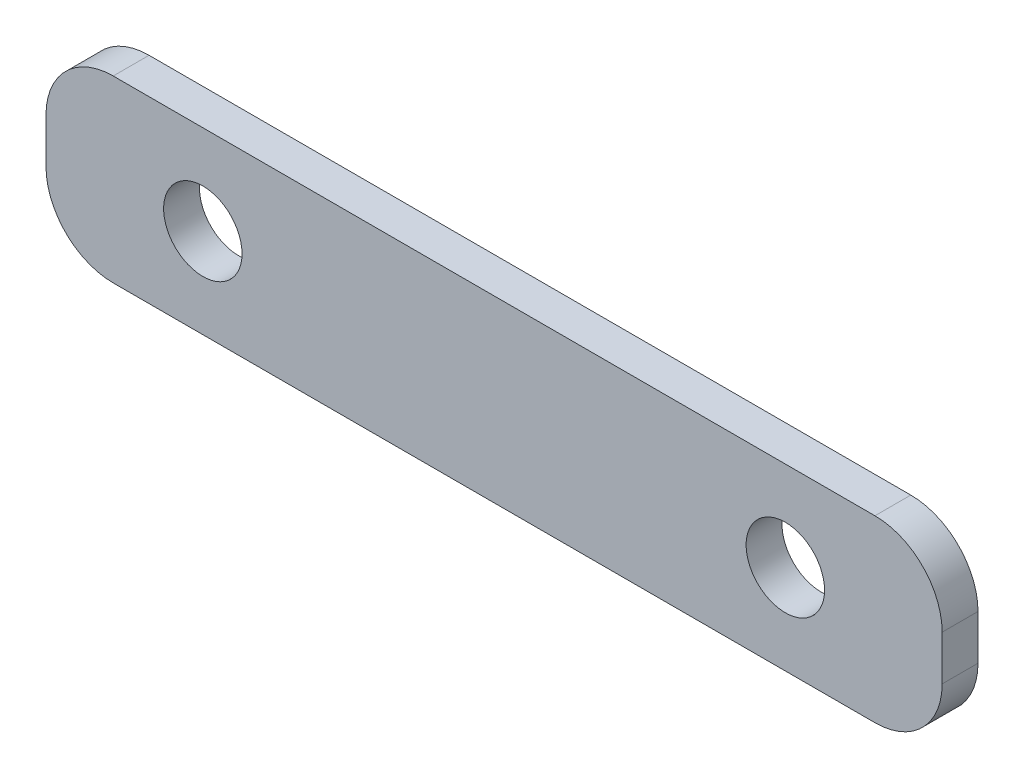
ISO-10303-21;
HEADER;
FILE_DESCRIPTION(('STEP AP214'),'2;1');
FILE_NAME('part.step','',(''),(''),'','','');
FILE_SCHEMA(('AUTOMOTIVE_DESIGN { 1 0 10303 214 1 1 1 1 }'));
ENDSEC;
DATA;
#1=APPLICATION_CONTEXT('core data for automotive mechanical design processes');
#2=APPLICATION_PROTOCOL_DEFINITION('international standard','automotive_design',2000,#1);
#3=PRODUCT_CONTEXT('',#1,'mechanical');
#4=PRODUCT('Part','Part','',(#3));
#5=PRODUCT_RELATED_PRODUCT_CATEGORY('part','',(#4));
#6=PRODUCT_DEFINITION_FORMATION('','',#4);
#7=PRODUCT_DEFINITION_CONTEXT('part definition',#1,'design');
#8=PRODUCT_DEFINITION('design','',#6,#7);
#9=PRODUCT_DEFINITION_SHAPE('','',#8);
#10=(LENGTH_UNIT() NAMED_UNIT(*) SI_UNIT(.MILLI.,.METRE.));
#11=(NAMED_UNIT(*) PLANE_ANGLE_UNIT() SI_UNIT($,.RADIAN.));
#12=(NAMED_UNIT(*) SI_UNIT($,.STERADIAN.) SOLID_ANGLE_UNIT());
#13=UNCERTAINTY_MEASURE_WITH_UNIT(LENGTH_MEASURE(1.E-05),#10,'distance_accuracy_value','');
#14=(GEOMETRIC_REPRESENTATION_CONTEXT(3) GLOBAL_UNCERTAINTY_ASSIGNED_CONTEXT((#13)) GLOBAL_UNIT_ASSIGNED_CONTEXT((#10,
#11,#12)) REPRESENTATION_CONTEXT('',''));
#15=CARTESIAN_POINT('',(0.,0.,0.));
#16=DIRECTION('',(0.,0.,1.));
#17=DIRECTION('',(1.,0.,0.));
#18=AXIS2_PLACEMENT_3D('',#15,#16,#17);
#19=CARTESIAN_POINT('',(200.,0.,4.));
#20=DIRECTION('',(0.,1.,0.));
#21=DIRECTION('',(-1.,0.,0.));
#22=AXIS2_PLACEMENT_3D('',#19,#20,#21);
#23=PLANE('',#22);
#24=DIRECTION('',(1.,0.,0.));
#25=VECTOR('',#24,1.);
#26=CARTESIAN_POINT('',(200.,0.,-4.));
#27=LINE('',#26,#25);
#28=CARTESIAN_POINT('',(15.,0.,-4.));
#29=VERTEX_POINT('',#28);
#30=CARTESIAN_POINT('',(185.,0.,-4.));
#31=VERTEX_POINT('',#30);
#32=EDGE_CURVE('E135',#29,#31,#27,.T.);
#33=ORIENTED_EDGE('',*,*,#32,.T.);
#34=DIRECTION('',(0.,0.,-1.));
#35=VECTOR('',#34,1.);
#36=CARTESIAN_POINT('',(185.,0.,4.));
#37=LINE('',#36,#35);
#38=CARTESIAN_POINT('',(185.,0.,4.));
#39=VERTEX_POINT('',#38);
#40=EDGE_CURVE('E110',#31,#39,#37,.F.);
#41=ORIENTED_EDGE('',*,*,#40,.T.);
#42=DIRECTION('',(1.,0.,0.));
#43=VECTOR('',#42,1.);
#44=CARTESIAN_POINT('',(200.,0.,4.));
#45=LINE('',#44,#43);
#46=CARTESIAN_POINT('',(15.,0.,4.));
#47=VERTEX_POINT('',#46);
#48=EDGE_CURVE('E148',#47,#39,#45,.T.);
#49=ORIENTED_EDGE('',*,*,#48,.F.);
#50=DIRECTION('',(0.,0.,-1.));
#51=VECTOR('',#50,1.);
#52=CARTESIAN_POINT('',(15.,0.,4.));
#53=LINE('',#52,#51);
#54=EDGE_CURVE('E116',#47,#29,#53,.T.);
#55=ORIENTED_EDGE('',*,*,#54,.T.);
#56=EDGE_LOOP('',(#33,#41,#49,#55));
#57=FACE_BOUND('',#56,.T.);
#58=ADVANCED_FACE('F39',(#57),#23,.F.);
#59=CARTESIAN_POINT('',(200.,40.,4.));
#60=DIRECTION('',(-1.,0.,0.));
#61=DIRECTION('',(0.,0.,1.));
#62=AXIS2_PLACEMENT_3D('',#59,#60,#61);
#63=PLANE('',#62);
#64=DIRECTION('',(0.,1.,0.));
#65=VECTOR('',#64,1.);
#66=CARTESIAN_POINT('',(200.,40.,4.));
#67=LINE('',#66,#65);
#68=CARTESIAN_POINT('',(200.,15.,4.));
#69=VERTEX_POINT('',#68);
#70=CARTESIAN_POINT('',(200.,25.,4.));
#71=VERTEX_POINT('',#70);
#72=EDGE_CURVE('E126',#69,#71,#67,.T.);
#73=ORIENTED_EDGE('',*,*,#72,.F.);
#74=DIRECTION('',(0.,0.,-1.));
#75=VECTOR('',#74,1.);
#76=CARTESIAN_POINT('',(200.,15.,4.));
#77=LINE('',#76,#75);
#78=CARTESIAN_POINT('',(200.,15.,-4.));
#79=VERTEX_POINT('',#78);
#80=EDGE_CURVE('E109',#69,#79,#77,.T.);
#81=ORIENTED_EDGE('',*,*,#80,.T.);
#82=DIRECTION('',(0.,1.,0.));
#83=VECTOR('',#82,1.);
#84=CARTESIAN_POINT('',(200.,40.,-4.));
#85=LINE('',#84,#83);
#86=CARTESIAN_POINT('',(200.,25.,-4.));
#87=VERTEX_POINT('',#86);
#88=EDGE_CURVE('E123',#79,#87,#85,.T.);
#89=ORIENTED_EDGE('',*,*,#88,.T.);
#90=DIRECTION('',(0.,0.,-1.));
#91=VECTOR('',#90,1.);
#92=CARTESIAN_POINT('',(200.,25.,4.));
#93=LINE('',#92,#91);
#94=EDGE_CURVE('E129',#87,#71,#93,.F.);
#95=ORIENTED_EDGE('',*,*,#94,.T.);
#96=EDGE_LOOP('',(#73,#81,#89,#95));
#97=FACE_BOUND('',#96,.T.);
#98=ADVANCED_FACE('F122',(#97),#63,.F.);
#99=CARTESIAN_POINT('',(0.,40.,4.));
#100=DIRECTION('',(0.,-1.,0.));
#101=DIRECTION('',(0.,0.,-1.));
#102=AXIS2_PLACEMENT_3D('',#99,#100,#101);
#103=PLANE('',#102);
#104=DIRECTION('',(-1.,0.,0.));
#105=VECTOR('',#104,1.);
#106=CARTESIAN_POINT('',(0.,40.,4.));
#107=LINE('',#106,#105);
#108=CARTESIAN_POINT('',(185.,40.,4.));
#109=VERTEX_POINT('',#108);
#110=CARTESIAN_POINT('',(15.,40.,4.));
#111=VERTEX_POINT('',#110);
#112=EDGE_CURVE('E197',#109,#111,#107,.T.);
#113=ORIENTED_EDGE('',*,*,#112,.F.);
#114=DIRECTION('',(0.,0.,-1.));
#115=VECTOR('',#114,1.);
#116=CARTESIAN_POINT('',(185.,40.,4.));
#117=LINE('',#116,#115);
#118=CARTESIAN_POINT('',(185.,40.,-4.));
#119=VERTEX_POINT('',#118);
#120=EDGE_CURVE('E178',#109,#119,#117,.T.);
#121=ORIENTED_EDGE('',*,*,#120,.T.);
#122=DIRECTION('',(-1.,0.,0.));
#123=VECTOR('',#122,1.);
#124=CARTESIAN_POINT('',(0.,40.,-4.));
#125=LINE('',#124,#123);
#126=CARTESIAN_POINT('',(15.,40.,-4.));
#127=VERTEX_POINT('',#126);
#128=EDGE_CURVE('E134',#119,#127,#125,.T.);
#129=ORIENTED_EDGE('',*,*,#128,.T.);
#130=DIRECTION('',(0.,0.,-1.));
#131=VECTOR('',#130,1.);
#132=CARTESIAN_POINT('',(15.,40.,4.));
#133=LINE('',#132,#131);
#134=EDGE_CURVE('E175',#127,#111,#133,.F.);
#135=ORIENTED_EDGE('',*,*,#134,.T.);
#136=EDGE_LOOP('',(#113,#121,#129,#135));
#137=FACE_BOUND('',#136,.T.);
#138=ADVANCED_FACE('F214',(#137),#103,.F.);
#139=CARTESIAN_POINT('',(0.,0.,4.));
#140=DIRECTION('',(1.,0.,0.));
#141=DIRECTION('',(0.,0.,-1.));
#142=AXIS2_PLACEMENT_3D('',#139,#140,#141);
#143=PLANE('',#142);
#144=DIRECTION('',(0.,-1.,0.));
#145=VECTOR('',#144,1.);
#146=CARTESIAN_POINT('',(0.,0.,-4.));
#147=LINE('',#146,#145);
#148=CARTESIAN_POINT('',(0.,25.,-4.));
#149=VERTEX_POINT('',#148);
#150=CARTESIAN_POINT('',(0.,15.,-4.));
#151=VERTEX_POINT('',#150);
#152=EDGE_CURVE('E140',#149,#151,#147,.T.);
#153=ORIENTED_EDGE('',*,*,#152,.T.);
#154=DIRECTION('',(0.,0.,-1.));
#155=VECTOR('',#154,1.);
#156=CARTESIAN_POINT('',(0.,15.,4.));
#157=LINE('',#156,#155);
#158=CARTESIAN_POINT('',(0.,15.,4.));
#159=VERTEX_POINT('',#158);
#160=EDGE_CURVE('E11',#151,#159,#157,.F.);
#161=ORIENTED_EDGE('',*,*,#160,.T.);
#162=DIRECTION('',(0.,-1.,0.));
#163=VECTOR('',#162,1.);
#164=CARTESIAN_POINT('',(0.,0.,4.));
#165=LINE('',#164,#163);
#166=CARTESIAN_POINT('',(0.,25.,4.));
#167=VERTEX_POINT('',#166);
#168=EDGE_CURVE('E150',#167,#159,#165,.T.);
#169=ORIENTED_EDGE('',*,*,#168,.F.);
#170=DIRECTION('',(0.,0.,-1.));
#171=VECTOR('',#170,1.);
#172=CARTESIAN_POINT('',(0.,25.,4.));
#173=LINE('',#172,#171);
#174=EDGE_CURVE('E48',#167,#149,#173,.T.);
#175=ORIENTED_EDGE('',*,*,#174,.T.);
#176=EDGE_LOOP('',(#153,#161,#169,#175));
#177=FACE_BOUND('',#176,.T.);
#178=ADVANCED_FACE('F185',(#177),#143,.F.);
#179=CARTESIAN_POINT('',(0.,0.,4.));
#180=DIRECTION('',(0.,0.,-1.));
#181=DIRECTION('',(-1.,0.,0.));
#182=AXIS2_PLACEMENT_3D('',#179,#180,#181);
#183=PLANE('',#182);
#184=CARTESIAN_POINT('',(35.,20.,4.));
#185=DIRECTION('',(0.,0.,1.));
#186=DIRECTION('',(1.,0.,0.));
#187=AXIS2_PLACEMENT_3D('',#184,#185,#186);
#188=CIRCLE('',#187,8.75);
#189=CARTESIAN_POINT('',(43.75,20.,4.));
#190=VERTEX_POINT('',#189);
#191=EDGE_CURVE('E310',#190,#190,#188,.T.);
#192=ORIENTED_EDGE('',*,*,#191,.F.);
#193=EDGE_LOOP('',(#192));
#194=FACE_BOUND('',#193,.T.);
#195=CARTESIAN_POINT('',(165.,20.,4.));
#196=DIRECTION('',(0.,0.,1.));
#197=DIRECTION('',(1.,0.,0.));
#198=AXIS2_PLACEMENT_3D('',#195,#196,#197);
#199=CIRCLE('',#198,8.75000000000001);
#200=CARTESIAN_POINT('',(173.75,20.,4.));
#201=VERTEX_POINT('',#200);
#202=EDGE_CURVE('E314',#201,#201,#199,.T.);
#203=ORIENTED_EDGE('',*,*,#202,.F.);
#204=EDGE_LOOP('',(#203));
#205=FACE_BOUND('',#204,.T.);
#206=ORIENTED_EDGE('',*,*,#48,.T.);
#207=CARTESIAN_POINT('',(185.,15.,4.));
#208=DIRECTION('',(0.,0.,-1.));
#209=DIRECTION('',(-1.,0.,0.));
#210=AXIS2_PLACEMENT_3D('',#207,#208,#209);
#211=CIRCLE('',#210,15.);
#212=EDGE_CURVE('E172',#39,#69,#211,.F.);
#213=ORIENTED_EDGE('',*,*,#212,.T.);
#214=ORIENTED_EDGE('',*,*,#72,.T.);
#215=CARTESIAN_POINT('',(185.,25.,4.));
#216=DIRECTION('',(0.,0.,-1.));
#217=DIRECTION('',(-1.,0.,0.));
#218=AXIS2_PLACEMENT_3D('',#215,#216,#217);
#219=CIRCLE('',#218,15.);
#220=EDGE_CURVE('E169',#71,#109,#219,.F.);
#221=ORIENTED_EDGE('',*,*,#220,.T.);
#222=ORIENTED_EDGE('',*,*,#112,.T.);
#223=CARTESIAN_POINT('',(15.,25.,4.));
#224=DIRECTION('',(0.,0.,-1.));
#225=DIRECTION('',(-1.,0.,0.));
#226=AXIS2_PLACEMENT_3D('',#223,#224,#225);
#227=CIRCLE('',#226,15.);
#228=EDGE_CURVE('E60',#111,#167,#227,.F.);
#229=ORIENTED_EDGE('',*,*,#228,.T.);
#230=ORIENTED_EDGE('',*,*,#168,.T.);
#231=CARTESIAN_POINT('',(15.,15.,4.));
#232=DIRECTION('',(0.,0.,-1.));
#233=DIRECTION('',(-1.,0.,0.));
#234=AXIS2_PLACEMENT_3D('',#231,#232,#233);
#235=CIRCLE('',#234,15.);
#236=EDGE_CURVE('E166',#159,#47,#235,.F.);
#237=ORIENTED_EDGE('',*,*,#236,.T.);
#238=EDGE_LOOP('',(#206,#213,#214,#221,#222,#229,#230,#237));
#239=FACE_BOUND('',#238,.T.);
#240=ADVANCED_FACE('F204',(#194,#205,#239),#183,.F.);
#241=CARTESIAN_POINT('',(0.,0.,-4.));
#242=DIRECTION('',(0.,0.,-1.));
#243=DIRECTION('',(-1.,0.,0.));
#244=AXIS2_PLACEMENT_3D('',#241,#242,#243);
#245=PLANE('',#244);
#246=CARTESIAN_POINT('',(35.,20.,-4.));
#247=DIRECTION('',(0.,0.,1.));
#248=DIRECTION('',(1.,0.,0.));
#249=AXIS2_PLACEMENT_3D('',#246,#247,#248);
#250=CIRCLE('',#249,8.75);
#251=CARTESIAN_POINT('',(43.75,20.,-4.));
#252=VERTEX_POINT('',#251);
#253=EDGE_CURVE('E308',#252,#252,#250,.T.);
#254=ORIENTED_EDGE('',*,*,#253,.T.);
#255=EDGE_LOOP('',(#254));
#256=FACE_BOUND('',#255,.T.);
#257=CARTESIAN_POINT('',(165.,20.,-4.));
#258=DIRECTION('',(0.,0.,1.));
#259=DIRECTION('',(1.,0.,0.));
#260=AXIS2_PLACEMENT_3D('',#257,#258,#259);
#261=CIRCLE('',#260,8.75000000000001);
#262=CARTESIAN_POINT('',(173.75,20.,-4.));
#263=VERTEX_POINT('',#262);
#264=EDGE_CURVE('E142',#263,#263,#261,.T.);
#265=ORIENTED_EDGE('',*,*,#264,.T.);
#266=EDGE_LOOP('',(#265));
#267=FACE_BOUND('',#266,.T.);
#268=ORIENTED_EDGE('',*,*,#88,.F.);
#269=CARTESIAN_POINT('',(185.,15.,-4.));
#270=DIRECTION('',(0.,0.,-1.));
#271=DIRECTION('',(-1.,0.,0.));
#272=AXIS2_PLACEMENT_3D('',#269,#270,#271);
#273=CIRCLE('',#272,15.);
#274=EDGE_CURVE('E105',#79,#31,#273,.T.);
#275=ORIENTED_EDGE('',*,*,#274,.T.);
#276=ORIENTED_EDGE('',*,*,#32,.F.);
#277=CARTESIAN_POINT('',(15.,15.,-4.));
#278=DIRECTION('',(0.,0.,-1.));
#279=DIRECTION('',(-1.,0.,0.));
#280=AXIS2_PLACEMENT_3D('',#277,#278,#279);
#281=CIRCLE('',#280,15.);
#282=EDGE_CURVE('E154',#29,#151,#281,.T.);
#283=ORIENTED_EDGE('',*,*,#282,.T.);
#284=ORIENTED_EDGE('',*,*,#152,.F.);
#285=CARTESIAN_POINT('',(15.,25.,-4.));
#286=DIRECTION('',(0.,0.,-1.));
#287=DIRECTION('',(-1.,0.,0.));
#288=AXIS2_PLACEMENT_3D('',#285,#286,#287);
#289=CIRCLE('',#288,15.);
#290=EDGE_CURVE('E128',#149,#127,#289,.T.);
#291=ORIENTED_EDGE('',*,*,#290,.T.);
#292=ORIENTED_EDGE('',*,*,#128,.F.);
#293=CARTESIAN_POINT('',(185.,25.,-4.));
#294=DIRECTION('',(0.,0.,-1.));
#295=DIRECTION('',(-1.,0.,0.));
#296=AXIS2_PLACEMENT_3D('',#293,#294,#295);
#297=CIRCLE('',#296,15.);
#298=EDGE_CURVE('E117',#119,#87,#297,.T.);
#299=ORIENTED_EDGE('',*,*,#298,.T.);
#300=EDGE_LOOP('',(#268,#275,#276,#283,#284,#291,#292,#299));
#301=FACE_BOUND('',#300,.T.);
#302=ADVANCED_FACE('F131',(#256,#267,#301),#245,.T.);
#303=CARTESIAN_POINT('',(185.,15.,4.));
#304=DIRECTION('',(0.,0.,-1.));
#305=DIRECTION('',(-1.,0.,0.));
#306=AXIS2_PLACEMENT_3D('',#303,#304,#305);
#307=CYLINDRICAL_SURFACE('',#306,15.);
#308=ORIENTED_EDGE('',*,*,#212,.F.);
#309=ORIENTED_EDGE('',*,*,#40,.F.);
#310=ORIENTED_EDGE('',*,*,#274,.F.);
#311=ORIENTED_EDGE('',*,*,#80,.F.);
#312=EDGE_LOOP('',(#308,#309,#310,#311));
#313=FACE_BOUND('',#312,.T.);
#314=ADVANCED_FACE('F108',(#313),#307,.T.);
#315=CARTESIAN_POINT('',(185.,25.,4.));
#316=DIRECTION('',(0.,0.,-1.));
#317=DIRECTION('',(-1.,0.,0.));
#318=AXIS2_PLACEMENT_3D('',#315,#316,#317);
#319=CYLINDRICAL_SURFACE('',#318,15.);
#320=ORIENTED_EDGE('',*,*,#220,.F.);
#321=ORIENTED_EDGE('',*,*,#94,.F.);
#322=ORIENTED_EDGE('',*,*,#298,.F.);
#323=ORIENTED_EDGE('',*,*,#120,.F.);
#324=EDGE_LOOP('',(#320,#321,#322,#323));
#325=FACE_BOUND('',#324,.T.);
#326=ADVANCED_FACE('F229',(#325),#319,.T.);
#327=CARTESIAN_POINT('',(15.,15.,4.));
#328=DIRECTION('',(0.,0.,-1.));
#329=DIRECTION('',(-1.,0.,0.));
#330=AXIS2_PLACEMENT_3D('',#327,#328,#329);
#331=CYLINDRICAL_SURFACE('',#330,15.);
#332=ORIENTED_EDGE('',*,*,#236,.F.);
#333=ORIENTED_EDGE('',*,*,#160,.F.);
#334=ORIENTED_EDGE('',*,*,#282,.F.);
#335=ORIENTED_EDGE('',*,*,#54,.F.);
#336=EDGE_LOOP('',(#332,#333,#334,#335));
#337=FACE_BOUND('',#336,.T.);
#338=ADVANCED_FACE('F190',(#337),#331,.T.);
#339=CARTESIAN_POINT('',(15.,25.,4.));
#340=DIRECTION('',(0.,0.,-1.));
#341=DIRECTION('',(-1.,0.,0.));
#342=AXIS2_PLACEMENT_3D('',#339,#340,#341);
#343=CYLINDRICAL_SURFACE('',#342,15.);
#344=ORIENTED_EDGE('',*,*,#228,.F.);
#345=ORIENTED_EDGE('',*,*,#134,.F.);
#346=ORIENTED_EDGE('',*,*,#290,.F.);
#347=ORIENTED_EDGE('',*,*,#174,.F.);
#348=EDGE_LOOP('',(#344,#345,#346,#347));
#349=FACE_BOUND('',#348,.T.);
#350=ADVANCED_FACE('F41',(#349),#343,.T.);
#351=CARTESIAN_POINT('',(165.,20.,4.));
#352=DIRECTION('',(0.,0.,1.));
#353=DIRECTION('',(1.,0.,0.));
#354=AXIS2_PLACEMENT_3D('',#351,#352,#353);
#355=CYLINDRICAL_SURFACE('',#354,8.75000000000001);
#356=ORIENTED_EDGE('',*,*,#264,.F.);
#357=EDGE_LOOP('',(#356));
#358=FACE_BOUND('',#357,.T.);
#359=ORIENTED_EDGE('',*,*,#202,.T.);
#360=EDGE_LOOP('',(#359));
#361=FACE_BOUND('',#360,.T.);
#362=ADVANCED_FACE('F236',(#358,#361),#355,.F.);
#363=CARTESIAN_POINT('',(35.,20.,4.));
#364=DIRECTION('',(0.,0.,1.));
#365=DIRECTION('',(1.,0.,0.));
#366=AXIS2_PLACEMENT_3D('',#363,#364,#365);
#367=CYLINDRICAL_SURFACE('',#366,8.75);
#368=ORIENTED_EDGE('',*,*,#253,.F.);
#369=EDGE_LOOP('',(#368));
#370=FACE_BOUND('',#369,.T.);
#371=ORIENTED_EDGE('',*,*,#191,.T.);
#372=EDGE_LOOP('',(#371));
#373=FACE_BOUND('',#372,.T.);
#374=ADVANCED_FACE('F240',(#370,#373),#367,.F.);
#375=CLOSED_SHELL('',(#58,#98,#138,#178,#240,#302,#314,#326,#338,#350,#362,#374));
#376=MANIFOLD_SOLID_BREP('B2',#375);
#377=ADVANCED_BREP_SHAPE_REPRESENTATION('',(#18,#376),#14);
#378=SHAPE_DEFINITION_REPRESENTATION(#9,#377);
ENDSEC;
END-ISO-10303-21;
